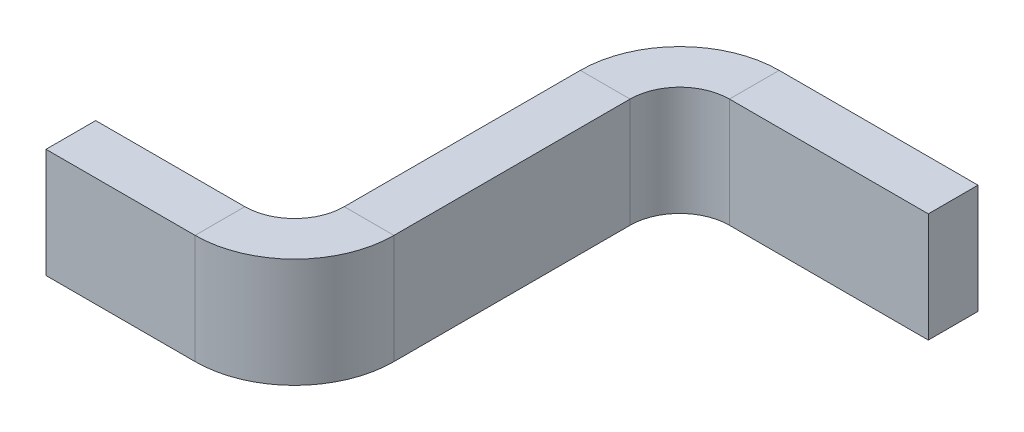
ISO-10303-21;
HEADER;
FILE_DESCRIPTION(('STEP AP214'),'2;1');
FILE_NAME('part.step','',(''),(''),'','','');
FILE_SCHEMA(('AUTOMOTIVE_DESIGN { 1 0 10303 214 1 1 1 1 }'));
ENDSEC;
DATA;
#1=APPLICATION_CONTEXT('core data for automotive mechanical design processes');
#2=APPLICATION_PROTOCOL_DEFINITION('international standard','automotive_design',2000,#1);
#3=PRODUCT_CONTEXT('',#1,'mechanical');
#4=PRODUCT('Part','Part','',(#3));
#5=PRODUCT_RELATED_PRODUCT_CATEGORY('part','',(#4));
#6=PRODUCT_DEFINITION_FORMATION('','',#4);
#7=PRODUCT_DEFINITION_CONTEXT('part definition',#1,'design');
#8=PRODUCT_DEFINITION('design','',#6,#7);
#9=PRODUCT_DEFINITION_SHAPE('','',#8);
#10=(LENGTH_UNIT() NAMED_UNIT(*) SI_UNIT(.MILLI.,.METRE.));
#11=(NAMED_UNIT(*) PLANE_ANGLE_UNIT() SI_UNIT($,.RADIAN.));
#12=(NAMED_UNIT(*) SI_UNIT($,.STERADIAN.) SOLID_ANGLE_UNIT());
#13=UNCERTAINTY_MEASURE_WITH_UNIT(LENGTH_MEASURE(1.E-05),#10,'distance_accuracy_value','');
#14=(GEOMETRIC_REPRESENTATION_CONTEXT(3) GLOBAL_UNCERTAINTY_ASSIGNED_CONTEXT((#13)) GLOBAL_UNIT_ASSIGNED_CONTEXT((#10,
#11,#12)) REPRESENTATION_CONTEXT('',''));
#15=CARTESIAN_POINT('',(0.,0.,0.));
#16=DIRECTION('',(0.,0.,1.));
#17=DIRECTION('',(1.,0.,0.));
#18=AXIS2_PLACEMENT_3D('',#15,#16,#17);
#19=CARTESIAN_POINT('',(0.,-0.11,0.775));
#20=DIRECTION('',(-1.,0.,0.));
#21=DIRECTION('',(0.,0.,1.));
#22=AXIS2_PLACEMENT_3D('',#19,#20,#21);
#23=PLANE('',#22);
#24=DIRECTION('',(0.,0.,1.));
#25=VECTOR('',#24,1.);
#26=CARTESIAN_POINT('',(0.,-0.11,0.875));
#27=LINE('',#26,#25);
#28=CARTESIAN_POINT('',(0.,-0.11,0.775));
#29=VERTEX_POINT('',#28);
#30=CARTESIAN_POINT('',(0.,-0.11,0.875));
#31=VERTEX_POINT('',#30);
#32=EDGE_CURVE('E145',#29,#31,#27,.T.);
#33=ORIENTED_EDGE('',*,*,#32,.T.);
#34=DIRECTION('',(0.,1.,0.));
#35=VECTOR('',#34,1.);
#36=CARTESIAN_POINT('',(0.,0.11,0.875));
#37=LINE('',#36,#35);
#38=CARTESIAN_POINT('',(0.,0.11,0.875));
#39=VERTEX_POINT('',#38);
#40=EDGE_CURVE('E154',#31,#39,#37,.T.);
#41=ORIENTED_EDGE('',*,*,#40,.T.);
#42=DIRECTION('',(0.,0.,-1.));
#43=VECTOR('',#42,1.);
#44=CARTESIAN_POINT('',(0.,0.11,0.775));
#45=LINE('',#44,#43);
#46=CARTESIAN_POINT('',(0.,0.11,0.775));
#47=VERTEX_POINT('',#46);
#48=EDGE_CURVE('E233',#39,#47,#45,.T.);
#49=ORIENTED_EDGE('',*,*,#48,.T.);
#50=DIRECTION('',(0.,-1.,0.));
#51=VECTOR('',#50,1.);
#52=CARTESIAN_POINT('',(0.,-0.11,0.775));
#53=LINE('',#52,#51);
#54=EDGE_CURVE('E11',#47,#29,#53,.T.);
#55=ORIENTED_EDGE('',*,*,#54,.T.);
#56=EDGE_LOOP('',(#33,#41,#49,#55));
#57=FACE_BOUND('',#56,.T.);
#58=ADVANCED_FACE('F16',(#57),#23,.T.);
#59=CARTESIAN_POINT('',(0.,-0.11,0.775));
#60=DIRECTION('',(0.,0.,1.));
#61=DIRECTION('',(1.,0.,0.));
#62=AXIS2_PLACEMENT_3D('',#59,#60,#61);
#63=PLANE('',#62);
#64=DIRECTION('',(0.,-1.,0.));
#65=VECTOR('',#64,1.);
#66=CARTESIAN_POINT('',(0.3,-0.11,0.775));
#67=LINE('',#66,#65);
#68=CARTESIAN_POINT('',(0.3,0.11,0.775));
#69=VERTEX_POINT('',#68);
#70=CARTESIAN_POINT('',(0.3,-0.11,0.775));
#71=VERTEX_POINT('',#70);
#72=EDGE_CURVE('E27',#69,#71,#67,.T.);
#73=ORIENTED_EDGE('',*,*,#72,.T.);
#74=DIRECTION('',(1.,0.,0.));
#75=VECTOR('',#74,1.);
#76=CARTESIAN_POINT('',(0.,-0.11,0.775));
#77=LINE('',#76,#75);
#78=EDGE_CURVE('E139',#29,#71,#77,.T.);
#79=ORIENTED_EDGE('',*,*,#78,.F.);
#80=ORIENTED_EDGE('',*,*,#54,.F.);
#81=DIRECTION('',(1.,0.,0.));
#82=VECTOR('',#81,1.);
#83=CARTESIAN_POINT('',(0.,0.11,0.775));
#84=LINE('',#83,#82);
#85=EDGE_CURVE('E269',#47,#69,#84,.T.);
#86=ORIENTED_EDGE('',*,*,#85,.T.);
#87=EDGE_LOOP('',(#73,#79,#80,#86));
#88=FACE_BOUND('',#87,.T.);
#89=ADVANCED_FACE('F556',(#88),#63,.F.);
#90=CARTESIAN_POINT('',(0.3,-0.11,0.675));
#91=DIRECTION('',(0.,1.,0.));
#92=DIRECTION('',(0.,0.,-1.));
#93=AXIS2_PLACEMENT_3D('',#90,#91,#92);
#94=CYLINDRICAL_SURFACE('',#93,0.1);
#95=DIRECTION('',(0.,1.,0.));
#96=VECTOR('',#95,1.);
#97=CARTESIAN_POINT('',(0.4,-0.11,0.675));
#98=LINE('',#97,#96);
#99=CARTESIAN_POINT('',(0.4,-0.11,0.675));
#100=VERTEX_POINT('',#99);
#101=CARTESIAN_POINT('',(0.4,0.11,0.675));
#102=VERTEX_POINT('',#101);
#103=EDGE_CURVE('E263',#100,#102,#98,.T.);
#104=ORIENTED_EDGE('',*,*,#103,.F.);
#105=CARTESIAN_POINT('',(0.3,-0.11,0.675));
#106=DIRECTION('',(0.,1.,0.));
#107=DIRECTION('',(0.,0.,-1.));
#108=AXIS2_PLACEMENT_3D('',#105,#106,#107);
#109=CIRCLE('',#108,0.1);
#110=EDGE_CURVE('E146',#71,#100,#109,.T.);
#111=ORIENTED_EDGE('',*,*,#110,.F.);
#112=ORIENTED_EDGE('',*,*,#72,.F.);
#113=CARTESIAN_POINT('',(0.3,0.11,0.675));
#114=DIRECTION('',(0.,1.,0.));
#115=DIRECTION('',(0.,0.,-1.));
#116=AXIS2_PLACEMENT_3D('',#113,#114,#115);
#117=CIRCLE('',#116,0.1);
#118=EDGE_CURVE('E220',#69,#102,#117,.T.);
#119=ORIENTED_EDGE('',*,*,#118,.T.);
#120=EDGE_LOOP('',(#104,#111,#112,#119));
#121=FACE_BOUND('',#120,.T.);
#122=ADVANCED_FACE('F551',(#121),#94,.F.);
#123=CARTESIAN_POINT('',(0.4,-0.11,0.675));
#124=DIRECTION('',(1.,0.,0.));
#125=DIRECTION('',(0.,1.,0.));
#126=AXIS2_PLACEMENT_3D('',#123,#124,#125);
#127=PLANE('',#126);
#128=DIRECTION('',(0.,-1.,0.));
#129=VECTOR('',#128,1.);
#130=CARTESIAN_POINT('',(0.4,-0.11,0.2));
#131=LINE('',#130,#129);
#132=CARTESIAN_POINT('',(0.4,0.11,0.2));
#133=VERTEX_POINT('',#132);
#134=CARTESIAN_POINT('',(0.4,-0.11,0.2));
#135=VERTEX_POINT('',#134);
#136=EDGE_CURVE('E266',#133,#135,#131,.T.);
#137=ORIENTED_EDGE('',*,*,#136,.T.);
#138=DIRECTION('',(0.,0.,-1.));
#139=VECTOR('',#138,1.);
#140=CARTESIAN_POINT('',(0.4,-0.11,0.675));
#141=LINE('',#140,#139);
#142=EDGE_CURVE('E189',#100,#135,#141,.T.);
#143=ORIENTED_EDGE('',*,*,#142,.F.);
#144=ORIENTED_EDGE('',*,*,#103,.T.);
#145=DIRECTION('',(0.,0.,-1.));
#146=VECTOR('',#145,1.);
#147=CARTESIAN_POINT('',(0.4,0.11,0.675));
#148=LINE('',#147,#146);
#149=EDGE_CURVE('E209',#102,#133,#148,.T.);
#150=ORIENTED_EDGE('',*,*,#149,.T.);
#151=EDGE_LOOP('',(#137,#143,#144,#150));
#152=FACE_BOUND('',#151,.T.);
#153=ADVANCED_FACE('F555',(#152),#127,.F.);
#154=CARTESIAN_POINT('',(0.6,-0.11,0.2));
#155=DIRECTION('',(0.,-1.,0.));
#156=DIRECTION('',(0.,0.,-1.));
#157=AXIS2_PLACEMENT_3D('',#154,#155,#156);
#158=CYLINDRICAL_SURFACE('',#157,0.2);
#159=CARTESIAN_POINT('',(0.6,0.11,0.2));
#160=DIRECTION('',(0.,-1.,0.));
#161=DIRECTION('',(0.,0.,-1.));
#162=AXIS2_PLACEMENT_3D('',#159,#160,#161);
#163=CIRCLE('',#162,0.2);
#164=CARTESIAN_POINT('',(0.6,0.11,0.));
#165=VERTEX_POINT('',#164);
#166=EDGE_CURVE('E20',#133,#165,#163,.T.);
#167=ORIENTED_EDGE('',*,*,#166,.T.);
#168=DIRECTION('',(0.,-1.,0.));
#169=VECTOR('',#168,1.);
#170=CARTESIAN_POINT('',(0.6,-0.11,0.));
#171=LINE('',#170,#169);
#172=CARTESIAN_POINT('',(0.6,-0.11,0.));
#173=VERTEX_POINT('',#172);
#174=EDGE_CURVE('E250',#165,#173,#171,.T.);
#175=ORIENTED_EDGE('',*,*,#174,.T.);
#176=CARTESIAN_POINT('',(0.6,-0.11,0.2));
#177=DIRECTION('',(0.,-1.,0.));
#178=DIRECTION('',(0.,0.,-1.));
#179=AXIS2_PLACEMENT_3D('',#176,#177,#178);
#180=CIRCLE('',#179,0.2);
#181=EDGE_CURVE('E187',#135,#173,#180,.T.);
#182=ORIENTED_EDGE('',*,*,#181,.F.);
#183=ORIENTED_EDGE('',*,*,#136,.F.);
#184=EDGE_LOOP('',(#167,#175,#182,#183));
#185=FACE_BOUND('',#184,.T.);
#186=ADVANCED_FACE('F502',(#185),#158,.T.);
#187=CARTESIAN_POINT('',(0.6,-0.11,0.));
#188=DIRECTION('',(0.,0.,1.));
#189=DIRECTION('',(1.,0.,0.));
#190=AXIS2_PLACEMENT_3D('',#187,#188,#189);
#191=PLANE('',#190);
#192=DIRECTION('',(0.,-1.,0.));
#193=VECTOR('',#192,1.);
#194=CARTESIAN_POINT('',(1.,-0.11,0.));
#195=LINE('',#194,#193);
#196=CARTESIAN_POINT('',(1.,0.11,0.));
#197=VERTEX_POINT('',#196);
#198=CARTESIAN_POINT('',(1.,-0.11,0.));
#199=VERTEX_POINT('',#198);
#200=EDGE_CURVE('E208',#197,#199,#195,.T.);
#201=ORIENTED_EDGE('',*,*,#200,.T.);
#202=DIRECTION('',(1.,0.,0.));
#203=VECTOR('',#202,1.);
#204=CARTESIAN_POINT('',(0.6,-0.11,0.));
#205=LINE('',#204,#203);
#206=EDGE_CURVE('E240',#173,#199,#205,.T.);
#207=ORIENTED_EDGE('',*,*,#206,.F.);
#208=ORIENTED_EDGE('',*,*,#174,.F.);
#209=DIRECTION('',(1.,0.,0.));
#210=VECTOR('',#209,1.);
#211=CARTESIAN_POINT('',(0.6,0.11,0.));
#212=LINE('',#211,#210);
#213=EDGE_CURVE('E247',#165,#197,#212,.T.);
#214=ORIENTED_EDGE('',*,*,#213,.T.);
#215=EDGE_LOOP('',(#201,#207,#208,#214));
#216=FACE_BOUND('',#215,.T.);
#217=ADVANCED_FACE('F498',(#216),#191,.F.);
#218=CARTESIAN_POINT('',(0.,-0.11,0.875));
#219=DIRECTION('',(0.,1.,0.));
#220=DIRECTION('',(1.,0.,0.));
#221=AXIS2_PLACEMENT_3D('',#218,#219,#220);
#222=PLANE('',#221);
#223=DIRECTION('',(0.,0.,1.));
#224=VECTOR('',#223,1.);
#225=CARTESIAN_POINT('',(0.3,-0.11,0.875));
#226=LINE('',#225,#224);
#227=CARTESIAN_POINT('',(0.3,-0.11,0.875));
#228=VERTEX_POINT('',#227);
#229=EDGE_CURVE('E133',#71,#228,#226,.T.);
#230=ORIENTED_EDGE('',*,*,#229,.T.);
#231=DIRECTION('',(1.,0.,0.));
#232=VECTOR('',#231,1.);
#233=CARTESIAN_POINT('',(0.,-0.11,0.875));
#234=LINE('',#233,#232);
#235=EDGE_CURVE('E137',#31,#228,#234,.T.);
#236=ORIENTED_EDGE('',*,*,#235,.F.);
#237=ORIENTED_EDGE('',*,*,#32,.F.);
#238=ORIENTED_EDGE('',*,*,#78,.T.);
#239=EDGE_LOOP('',(#230,#236,#237,#238));
#240=FACE_BOUND('',#239,.T.);
#241=ADVANCED_FACE('F135',(#240),#222,.F.);
#242=CARTESIAN_POINT('',(0.406066017178,-0.11,0.781066017178));
#243=DIRECTION('',(0.,-1.,0.));
#244=DIRECTION('',(0.,0.,-1.));
#245=AXIS2_PLACEMENT_3D('',#242,#243,#244);
#246=PLANE('',#245);
#247=ORIENTED_EDGE('',*,*,#110,.T.);
#248=DIRECTION('',(1.,0.,0.));
#249=VECTOR('',#248,1.);
#250=CARTESIAN_POINT('',(0.5,-0.11,0.675));
#251=LINE('',#250,#249);
#252=CARTESIAN_POINT('',(0.5,-0.11,0.675));
#253=VERTEX_POINT('',#252);
#254=EDGE_CURVE('E170',#100,#253,#251,.T.);
#255=ORIENTED_EDGE('',*,*,#254,.T.);
#256=CARTESIAN_POINT('',(0.3,-0.11,0.675));
#257=DIRECTION('',(0.,1.,0.));
#258=DIRECTION('',(0.,0.,-1.));
#259=AXIS2_PLACEMENT_3D('',#256,#257,#258);
#260=CIRCLE('',#259,0.2);
#261=EDGE_CURVE('E162',#228,#253,#260,.T.);
#262=ORIENTED_EDGE('',*,*,#261,.F.);
#263=ORIENTED_EDGE('',*,*,#229,.F.);
#264=EDGE_LOOP('',(#247,#255,#262,#263));
#265=FACE_BOUND('',#264,.T.);
#266=ADVANCED_FACE('F168',(#265),#246,.T.);
#267=CARTESIAN_POINT('',(0.5,-0.11,0.675));
#268=DIRECTION('',(0.,1.,0.));
#269=DIRECTION('',(1.,0.,0.));
#270=AXIS2_PLACEMENT_3D('',#267,#268,#269);
#271=PLANE('',#270);
#272=DIRECTION('',(1.,0.,0.));
#273=VECTOR('',#272,1.);
#274=CARTESIAN_POINT('',(0.5,-0.11,0.2));
#275=LINE('',#274,#273);
#276=CARTESIAN_POINT('',(0.5,-0.11,0.2));
#277=VERTEX_POINT('',#276);
#278=EDGE_CURVE('E185',#135,#277,#275,.T.);
#279=ORIENTED_EDGE('',*,*,#278,.T.);
#280=DIRECTION('',(0.,0.,-1.));
#281=VECTOR('',#280,1.);
#282=CARTESIAN_POINT('',(0.5,-0.11,0.675));
#283=LINE('',#282,#281);
#284=EDGE_CURVE('E172',#253,#277,#283,.T.);
#285=ORIENTED_EDGE('',*,*,#284,.F.);
#286=ORIENTED_EDGE('',*,*,#254,.F.);
#287=ORIENTED_EDGE('',*,*,#142,.T.);
#288=EDGE_LOOP('',(#279,#285,#286,#287));
#289=FACE_BOUND('',#288,.T.);
#290=ADVANCED_FACE('F513',(#289),#271,.F.);
#291=CARTESIAN_POINT('',(0.493933982822,-0.11,0.09393398282202));
#292=DIRECTION('',(0.,-1.,0.));
#293=DIRECTION('',(0.,0.,-1.));
#294=AXIS2_PLACEMENT_3D('',#291,#292,#293);
#295=PLANE('',#294);
#296=ORIENTED_EDGE('',*,*,#181,.T.);
#297=DIRECTION('',(0.,0.,1.));
#298=VECTOR('',#297,1.);
#299=CARTESIAN_POINT('',(0.6,-0.11,0.1));
#300=LINE('',#299,#298);
#301=CARTESIAN_POINT('',(0.6,-0.11,0.1));
#302=VERTEX_POINT('',#301);
#303=EDGE_CURVE('E156',#173,#302,#300,.T.);
#304=ORIENTED_EDGE('',*,*,#303,.T.);
#305=CARTESIAN_POINT('',(0.6,-0.11,0.2));
#306=DIRECTION('',(0.,-1.,0.));
#307=DIRECTION('',(0.,0.,-1.));
#308=AXIS2_PLACEMENT_3D('',#305,#306,#307);
#309=CIRCLE('',#308,0.1);
#310=EDGE_CURVE('E198',#277,#302,#309,.T.);
#311=ORIENTED_EDGE('',*,*,#310,.F.);
#312=ORIENTED_EDGE('',*,*,#278,.F.);
#313=EDGE_LOOP('',(#296,#304,#311,#312));
#314=FACE_BOUND('',#313,.T.);
#315=ADVANCED_FACE('F508',(#314),#295,.T.);
#316=CARTESIAN_POINT('',(0.6,-0.11,0.1));
#317=DIRECTION('',(0.,1.,0.));
#318=DIRECTION('',(1.,0.,0.));
#319=AXIS2_PLACEMENT_3D('',#316,#317,#318);
#320=PLANE('',#319);
#321=DIRECTION('',(0.,0.,1.));
#322=VECTOR('',#321,1.);
#323=CARTESIAN_POINT('',(1.,-0.11,0.1));
#324=LINE('',#323,#322);
#325=CARTESIAN_POINT('',(1.,-0.11,0.1));
#326=VERTEX_POINT('',#325);
#327=EDGE_CURVE('E243',#199,#326,#324,.T.);
#328=ORIENTED_EDGE('',*,*,#327,.T.);
#329=DIRECTION('',(1.,0.,0.));
#330=VECTOR('',#329,1.);
#331=CARTESIAN_POINT('',(0.6,-0.11,0.1));
#332=LINE('',#331,#330);
#333=EDGE_CURVE('E183',#302,#326,#332,.T.);
#334=ORIENTED_EDGE('',*,*,#333,.F.);
#335=ORIENTED_EDGE('',*,*,#303,.F.);
#336=ORIENTED_EDGE('',*,*,#206,.T.);
#337=EDGE_LOOP('',(#328,#334,#335,#336));
#338=FACE_BOUND('',#337,.T.);
#339=ADVANCED_FACE('F512',(#338),#320,.F.);
#340=CARTESIAN_POINT('',(0.,0.11,0.875));
#341=DIRECTION('',(0.,0.,-1.));
#342=DIRECTION('',(0.,-1.,0.));
#343=AXIS2_PLACEMENT_3D('',#340,#341,#342);
#344=PLANE('',#343);
#345=DIRECTION('',(0.,1.,0.));
#346=VECTOR('',#345,1.);
#347=CARTESIAN_POINT('',(0.3,0.11,0.875));
#348=LINE('',#347,#346);
#349=CARTESIAN_POINT('',(0.3,0.11,0.875));
#350=VERTEX_POINT('',#349);
#351=EDGE_CURVE('E152',#228,#350,#348,.T.);
#352=ORIENTED_EDGE('',*,*,#351,.T.);
#353=DIRECTION('',(1.,0.,0.));
#354=VECTOR('',#353,1.);
#355=CARTESIAN_POINT('',(0.,0.11,0.875));
#356=LINE('',#355,#354);
#357=EDGE_CURVE('E229',#39,#350,#356,.T.);
#358=ORIENTED_EDGE('',*,*,#357,.F.);
#359=ORIENTED_EDGE('',*,*,#40,.F.);
#360=ORIENTED_EDGE('',*,*,#235,.T.);
#361=EDGE_LOOP('',(#352,#358,#359,#360));
#362=FACE_BOUND('',#361,.T.);
#363=ADVANCED_FACE('F150',(#362),#344,.F.);
#364=CARTESIAN_POINT('',(0.3,0.11,0.675));
#365=DIRECTION('',(0.,1.,0.));
#366=DIRECTION('',(0.,0.,-1.));
#367=AXIS2_PLACEMENT_3D('',#364,#365,#366);
#368=CYLINDRICAL_SURFACE('',#367,0.2);
#369=ORIENTED_EDGE('',*,*,#261,.T.);
#370=DIRECTION('',(0.,1.,0.));
#371=VECTOR('',#370,1.);
#372=CARTESIAN_POINT('',(0.5,0.11,0.675));
#373=LINE('',#372,#371);
#374=CARTESIAN_POINT('',(0.5,0.11,0.675));
#375=VERTEX_POINT('',#374);
#376=EDGE_CURVE('E179',#253,#375,#373,.T.);
#377=ORIENTED_EDGE('',*,*,#376,.T.);
#378=CARTESIAN_POINT('',(0.3,0.11,0.675));
#379=DIRECTION('',(0.,1.,0.));
#380=DIRECTION('',(0.,0.,-1.));
#381=AXIS2_PLACEMENT_3D('',#378,#379,#380);
#382=CIRCLE('',#381,0.2);
#383=EDGE_CURVE('E165',#350,#375,#382,.T.);
#384=ORIENTED_EDGE('',*,*,#383,.F.);
#385=ORIENTED_EDGE('',*,*,#351,.F.);
#386=EDGE_LOOP('',(#369,#377,#384,#385));
#387=FACE_BOUND('',#386,.T.);
#388=ADVANCED_FACE('F161',(#387),#368,.T.);
#389=CARTESIAN_POINT('',(0.5,0.11,0.675));
#390=DIRECTION('',(-1.,0.,0.));
#391=DIRECTION('',(0.,0.,1.));
#392=AXIS2_PLACEMENT_3D('',#389,#390,#391);
#393=PLANE('',#392);
#394=DIRECTION('',(0.,1.,0.));
#395=VECTOR('',#394,1.);
#396=CARTESIAN_POINT('',(0.5,0.11,0.2));
#397=LINE('',#396,#395);
#398=CARTESIAN_POINT('',(0.5,0.11,0.2));
#399=VERTEX_POINT('',#398);
#400=EDGE_CURVE('E202',#277,#399,#397,.T.);
#401=ORIENTED_EDGE('',*,*,#400,.T.);
#402=DIRECTION('',(0.,0.,-1.));
#403=VECTOR('',#402,1.);
#404=CARTESIAN_POINT('',(0.5,0.11,0.675));
#405=LINE('',#404,#403);
#406=EDGE_CURVE('E217',#375,#399,#405,.T.);
#407=ORIENTED_EDGE('',*,*,#406,.F.);
#408=ORIENTED_EDGE('',*,*,#376,.F.);
#409=ORIENTED_EDGE('',*,*,#284,.T.);
#410=EDGE_LOOP('',(#401,#407,#408,#409));
#411=FACE_BOUND('',#410,.T.);
#412=ADVANCED_FACE('F538',(#411),#393,.F.);
#413=CARTESIAN_POINT('',(0.6,0.11,0.2));
#414=DIRECTION('',(0.,-1.,0.));
#415=DIRECTION('',(0.,0.,-1.));
#416=AXIS2_PLACEMENT_3D('',#413,#414,#415);
#417=CYLINDRICAL_SURFACE('',#416,0.1);
#418=DIRECTION('',(0.,-1.,0.));
#419=VECTOR('',#418,1.);
#420=CARTESIAN_POINT('',(0.6,0.11,0.1));
#421=LINE('',#420,#419);
#422=CARTESIAN_POINT('',(0.6,0.11,0.1));
#423=VERTEX_POINT('',#422);
#424=EDGE_CURVE('E232',#423,#302,#421,.T.);
#425=ORIENTED_EDGE('',*,*,#424,.F.);
#426=CARTESIAN_POINT('',(0.6,0.11,0.2));
#427=DIRECTION('',(0.,-1.,0.));
#428=DIRECTION('',(0.,0.,-1.));
#429=AXIS2_PLACEMENT_3D('',#426,#427,#428);
#430=CIRCLE('',#429,0.1);
#431=EDGE_CURVE('E195',#399,#423,#430,.T.);
#432=ORIENTED_EDGE('',*,*,#431,.F.);
#433=ORIENTED_EDGE('',*,*,#400,.F.);
#434=ORIENTED_EDGE('',*,*,#310,.T.);
#435=EDGE_LOOP('',(#425,#432,#433,#434));
#436=FACE_BOUND('',#435,.T.);
#437=ADVANCED_FACE('F534',(#436),#417,.F.);
#438=CARTESIAN_POINT('',(0.6,0.11,0.1));
#439=DIRECTION('',(0.,0.,-1.));
#440=DIRECTION('',(0.,-1.,0.));
#441=AXIS2_PLACEMENT_3D('',#438,#439,#440);
#442=PLANE('',#441);
#443=DIRECTION('',(0.,1.,0.));
#444=VECTOR('',#443,1.);
#445=CARTESIAN_POINT('',(1.,0.11,0.1));
#446=LINE('',#445,#444);
#447=CARTESIAN_POINT('',(1.,0.11,0.1));
#448=VERTEX_POINT('',#447);
#449=EDGE_CURVE('E207',#326,#448,#446,.T.);
#450=ORIENTED_EDGE('',*,*,#449,.T.);
#451=DIRECTION('',(1.,0.,0.));
#452=VECTOR('',#451,1.);
#453=CARTESIAN_POINT('',(0.6,0.11,0.1));
#454=LINE('',#453,#452);
#455=EDGE_CURVE('E193',#423,#448,#454,.T.);
#456=ORIENTED_EDGE('',*,*,#455,.F.);
#457=ORIENTED_EDGE('',*,*,#424,.T.);
#458=ORIENTED_EDGE('',*,*,#333,.T.);
#459=EDGE_LOOP('',(#450,#456,#457,#458));
#460=FACE_BOUND('',#459,.T.);
#461=ADVANCED_FACE('F18',(#460),#442,.F.);
#462=CARTESIAN_POINT('',(0.,0.11,0.775));
#463=DIRECTION('',(0.,-1.,0.));
#464=DIRECTION('',(0.,0.,-1.));
#465=AXIS2_PLACEMENT_3D('',#462,#463,#464);
#466=PLANE('',#465);
#467=DIRECTION('',(0.,0.,-1.));
#468=VECTOR('',#467,1.);
#469=CARTESIAN_POINT('',(0.3,0.11,0.775));
#470=LINE('',#469,#468);
#471=EDGE_CURVE('E407',#350,#69,#470,.T.);
#472=ORIENTED_EDGE('',*,*,#471,.T.);
#473=ORIENTED_EDGE('',*,*,#85,.F.);
#474=ORIENTED_EDGE('',*,*,#48,.F.);
#475=ORIENTED_EDGE('',*,*,#357,.T.);
#476=EDGE_LOOP('',(#472,#473,#474,#475));
#477=FACE_BOUND('',#476,.T.);
#478=ADVANCED_FACE('F590',(#477),#466,.F.);
#479=CARTESIAN_POINT('',(0.406066017178,0.11,0.781066017178));
#480=DIRECTION('',(0.,1.,0.));
#481=DIRECTION('',(1.,0.,0.));
#482=AXIS2_PLACEMENT_3D('',#479,#480,#481);
#483=PLANE('',#482);
#484=ORIENTED_EDGE('',*,*,#383,.T.);
#485=DIRECTION('',(-1.,0.,0.));
#486=VECTOR('',#485,1.);
#487=CARTESIAN_POINT('',(0.4,0.11,0.675));
#488=LINE('',#487,#486);
#489=EDGE_CURVE('E213',#375,#102,#488,.T.);
#490=ORIENTED_EDGE('',*,*,#489,.T.);
#491=ORIENTED_EDGE('',*,*,#118,.F.);
#492=ORIENTED_EDGE('',*,*,#471,.F.);
#493=EDGE_LOOP('',(#484,#490,#491,#492));
#494=FACE_BOUND('',#493,.T.);
#495=ADVANCED_FACE('F585',(#494),#483,.T.);
#496=CARTESIAN_POINT('',(0.4,0.11,0.675));
#497=DIRECTION('',(0.,-1.,0.));
#498=DIRECTION('',(0.,0.,-1.));
#499=AXIS2_PLACEMENT_3D('',#496,#497,#498);
#500=PLANE('',#499);
#501=DIRECTION('',(-1.,0.,0.));
#502=VECTOR('',#501,1.);
#503=CARTESIAN_POINT('',(0.4,0.11,0.2));
#504=LINE('',#503,#502);
#505=EDGE_CURVE('E214',#399,#133,#504,.T.);
#506=ORIENTED_EDGE('',*,*,#505,.T.);
#507=ORIENTED_EDGE('',*,*,#149,.F.);
#508=ORIENTED_EDGE('',*,*,#489,.F.);
#509=ORIENTED_EDGE('',*,*,#406,.T.);
#510=EDGE_LOOP('',(#506,#507,#508,#509));
#511=FACE_BOUND('',#510,.T.);
#512=ADVANCED_FACE('F589',(#511),#500,.F.);
#513=CARTESIAN_POINT('',(0.493933982822,0.11,0.09393398282202));
#514=DIRECTION('',(0.,1.,0.));
#515=DIRECTION('',(1.,0.,0.));
#516=AXIS2_PLACEMENT_3D('',#513,#514,#515);
#517=PLANE('',#516);
#518=ORIENTED_EDGE('',*,*,#431,.T.);
#519=DIRECTION('',(0.,0.,-1.));
#520=VECTOR('',#519,1.);
#521=CARTESIAN_POINT('',(0.6,0.11,0.));
#522=LINE('',#521,#520);
#523=EDGE_CURVE('E196',#423,#165,#522,.T.);
#524=ORIENTED_EDGE('',*,*,#523,.T.);
#525=ORIENTED_EDGE('',*,*,#166,.F.);
#526=ORIENTED_EDGE('',*,*,#505,.F.);
#527=EDGE_LOOP('',(#518,#524,#525,#526));
#528=FACE_BOUND('',#527,.T.);
#529=ADVANCED_FACE('F523',(#528),#517,.T.);
#530=CARTESIAN_POINT('',(0.6,0.11,0.));
#531=DIRECTION('',(0.,-1.,0.));
#532=DIRECTION('',(0.,0.,-1.));
#533=AXIS2_PLACEMENT_3D('',#530,#531,#532);
#534=PLANE('',#533);
#535=DIRECTION('',(0.,0.,-1.));
#536=VECTOR('',#535,1.);
#537=CARTESIAN_POINT('',(1.,0.11,0.));
#538=LINE('',#537,#536);
#539=EDGE_CURVE('E203',#448,#197,#538,.T.);
#540=ORIENTED_EDGE('',*,*,#539,.T.);
#541=ORIENTED_EDGE('',*,*,#213,.F.);
#542=ORIENTED_EDGE('',*,*,#523,.F.);
#543=ORIENTED_EDGE('',*,*,#455,.T.);
#544=EDGE_LOOP('',(#540,#541,#542,#543));
#545=FACE_BOUND('',#544,.T.);
#546=ADVANCED_FACE('F519',(#545),#534,.F.);
#547=CARTESIAN_POINT('',(1.,-0.11,0.));
#548=DIRECTION('',(-1.,0.,0.));
#549=DIRECTION('',(0.,0.,1.));
#550=AXIS2_PLACEMENT_3D('',#547,#548,#549);
#551=PLANE('',#550);
#552=ORIENTED_EDGE('',*,*,#200,.F.);
#553=ORIENTED_EDGE('',*,*,#539,.F.);
#554=ORIENTED_EDGE('',*,*,#449,.F.);
#555=ORIENTED_EDGE('',*,*,#327,.F.);
#556=EDGE_LOOP('',(#552,#553,#554,#555));
#557=FACE_BOUND('',#556,.T.);
#558=ADVANCED_FACE('F448',(#557),#551,.F.);
#559=CLOSED_SHELL('',(#58,#89,#122,#153,#186,#217,#241,#266,#290,#315,#339,#363,#388,#412,#437,
#461,#478,#495,#512,#529,#546,#558));
#560=MANIFOLD_SOLID_BREP('B1',#559);
#561=ADVANCED_BREP_SHAPE_REPRESENTATION('',(#18,#560),#14);
#562=SHAPE_DEFINITION_REPRESENTATION(#9,#561);
ENDSEC;
END-ISO-10303-21;
